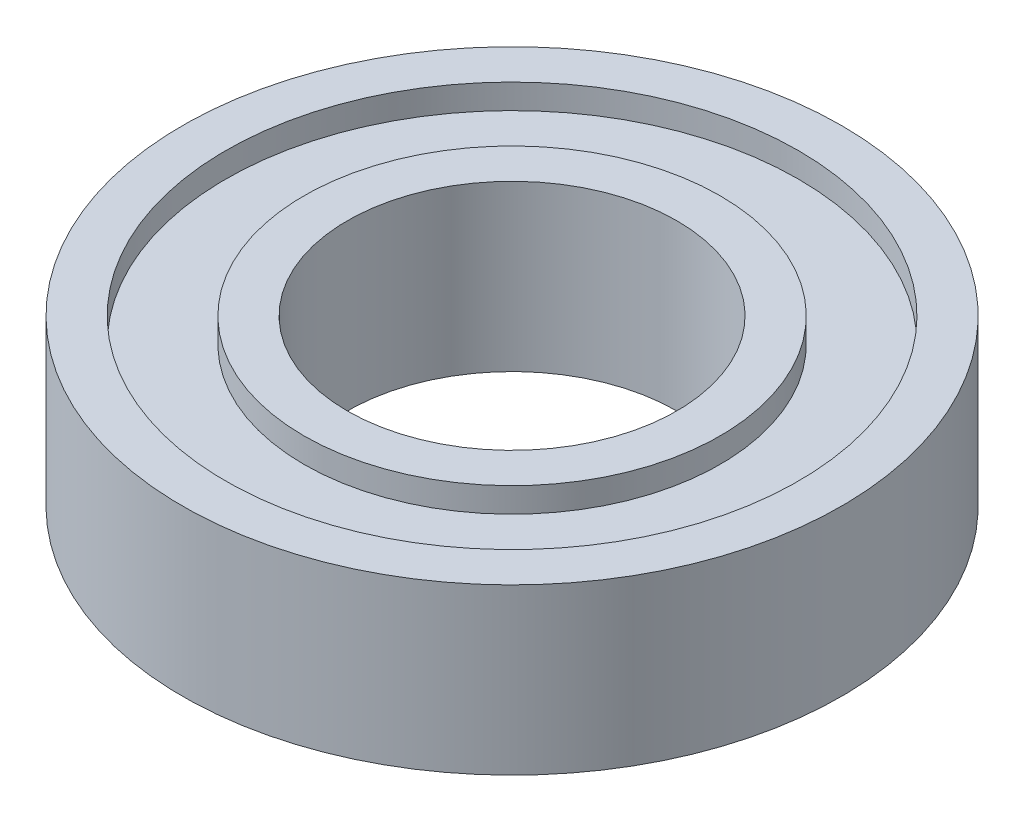
ISO-10303-21;
HEADER;
FILE_DESCRIPTION(('STEP AP214'),'2;1');
FILE_NAME('part.step','',(''),(''),'','','');
FILE_SCHEMA(('AUTOMOTIVE_DESIGN { 1 0 10303 214 1 1 1 1 }'));
ENDSEC;
DATA;
#1=APPLICATION_CONTEXT('core data for automotive mechanical design processes');
#2=APPLICATION_PROTOCOL_DEFINITION('international standard','automotive_design',2000,#1);
#3=PRODUCT_CONTEXT('',#1,'mechanical');
#4=PRODUCT('Part','Part','',(#3));
#5=PRODUCT_RELATED_PRODUCT_CATEGORY('part','',(#4));
#6=PRODUCT_DEFINITION_FORMATION('','',#4);
#7=PRODUCT_DEFINITION_CONTEXT('part definition',#1,'design');
#8=PRODUCT_DEFINITION('design','',#6,#7);
#9=PRODUCT_DEFINITION_SHAPE('','',#8);
#10=(LENGTH_UNIT() NAMED_UNIT(*) SI_UNIT(.MILLI.,.METRE.));
#11=(NAMED_UNIT(*) PLANE_ANGLE_UNIT() SI_UNIT($,.RADIAN.));
#12=(NAMED_UNIT(*) SI_UNIT($,.STERADIAN.) SOLID_ANGLE_UNIT());
#13=UNCERTAINTY_MEASURE_WITH_UNIT(LENGTH_MEASURE(1.E-05),#10,'distance_accuracy_value','');
#14=(GEOMETRIC_REPRESENTATION_CONTEXT(3) GLOBAL_UNCERTAINTY_ASSIGNED_CONTEXT((#13)) GLOBAL_UNIT_ASSIGNED_CONTEXT((#10,
#11,#12)) REPRESENTATION_CONTEXT('',''));
#15=CARTESIAN_POINT('',(0.,0.,0.));
#16=DIRECTION('',(0.,0.,1.));
#17=DIRECTION('',(1.,0.,0.));
#18=AXIS2_PLACEMENT_3D('',#15,#16,#17);
#19=CARTESIAN_POINT('',(5.05,0.,0.));
#20=DIRECTION('',(0.,-1.,0.));
#21=DIRECTION('',(0.,0.,-1.));
#22=AXIS2_PLACEMENT_3D('',#19,#20,#21);
#23=PLANE('',#22);
#24=CARTESIAN_POINT('',(0.,0.,0.));
#25=DIRECTION('',(0.,-1.,0.));
#26=DIRECTION('',(0.,0.,-1.));
#27=AXIS2_PLACEMENT_3D('',#24,#25,#26);
#28=CIRCLE('',#27,5.05);
#29=CARTESIAN_POINT('',(0.,0.,-5.05));
#30=VERTEX_POINT('',#29);
#31=EDGE_CURVE('E96',#30,#30,#28,.T.);
#32=ORIENTED_EDGE('',*,*,#31,.T.);
#33=EDGE_LOOP('',(#32));
#34=FACE_BOUND('',#33,.T.);
#35=CARTESIAN_POINT('',(0.,0.,0.));
#36=DIRECTION('',(0.,-1.,0.));
#37=DIRECTION('',(0.,0.,-1.));
#38=AXIS2_PLACEMENT_3D('',#35,#36,#37);
#39=CIRCLE('',#38,4.);
#40=CARTESIAN_POINT('',(0.,0.,-4.));
#41=VERTEX_POINT('',#40);
#42=EDGE_CURVE('E10',#41,#41,#39,.T.);
#43=ORIENTED_EDGE('',*,*,#42,.F.);
#44=EDGE_LOOP('',(#43));
#45=FACE_BOUND('',#44,.T.);
#46=ADVANCED_FACE('F45',(#34,#45),#23,.T.);
#47=CARTESIAN_POINT('',(0.,0.,0.));
#48=DIRECTION('',(0.,-1.,0.));
#49=DIRECTION('',(0.,0.,-1.));
#50=AXIS2_PLACEMENT_3D('',#47,#48,#49);
#51=CYLINDRICAL_SURFACE('',#50,4.);
#52=ORIENTED_EDGE('',*,*,#42,.T.);
#53=EDGE_LOOP('',(#52));
#54=FACE_BOUND('',#53,.T.);
#55=CARTESIAN_POINT('',(0.,4.,0.));
#56=DIRECTION('',(0.,-1.,0.));
#57=DIRECTION('',(0.,0.,-1.));
#58=AXIS2_PLACEMENT_3D('',#55,#56,#57);
#59=CIRCLE('',#58,4.);
#60=CARTESIAN_POINT('',(0.,4.,-4.));
#61=VERTEX_POINT('',#60);
#62=EDGE_CURVE('E52',#61,#61,#59,.T.);
#63=ORIENTED_EDGE('',*,*,#62,.F.);
#64=EDGE_LOOP('',(#63));
#65=FACE_BOUND('',#64,.T.);
#66=ADVANCED_FACE('F115',(#54,#65),#51,.F.);
#67=CARTESIAN_POINT('',(4.,4.,0.));
#68=DIRECTION('',(0.,1.,0.));
#69=DIRECTION('',(0.,0.,1.));
#70=AXIS2_PLACEMENT_3D('',#67,#68,#69);
#71=PLANE('',#70);
#72=ORIENTED_EDGE('',*,*,#62,.T.);
#73=EDGE_LOOP('',(#72));
#74=FACE_BOUND('',#73,.T.);
#75=CARTESIAN_POINT('',(0.,4.,0.));
#76=DIRECTION('',(0.,-1.,0.));
#77=DIRECTION('',(0.,0.,-1.));
#78=AXIS2_PLACEMENT_3D('',#75,#76,#77);
#79=CIRCLE('',#78,5.05);
#80=CARTESIAN_POINT('',(0.,4.,-5.05));
#81=VERTEX_POINT('',#80);
#82=EDGE_CURVE('E59',#81,#81,#79,.T.);
#83=ORIENTED_EDGE('',*,*,#82,.F.);
#84=EDGE_LOOP('',(#83));
#85=FACE_BOUND('',#84,.T.);
#86=ADVANCED_FACE('F119',(#74,#85),#71,.T.);
#87=CARTESIAN_POINT('',(0.,0.,0.));
#88=DIRECTION('',(0.,-1.,0.));
#89=DIRECTION('',(0.,0.,-1.));
#90=AXIS2_PLACEMENT_3D('',#87,#88,#89);
#91=CYLINDRICAL_SURFACE('',#90,5.05);
#92=ORIENTED_EDGE('',*,*,#82,.T.);
#93=EDGE_LOOP('',(#92));
#94=FACE_BOUND('',#93,.T.);
#95=CARTESIAN_POINT('',(0.,3.4,0.));
#96=DIRECTION('',(0.,-1.,0.));
#97=DIRECTION('',(0.,0.,-1.));
#98=AXIS2_PLACEMENT_3D('',#95,#96,#97);
#99=CIRCLE('',#98,5.05);
#100=CARTESIAN_POINT('',(0.,3.4,-5.05));
#101=VERTEX_POINT('',#100);
#102=EDGE_CURVE('E65',#101,#101,#99,.T.);
#103=ORIENTED_EDGE('',*,*,#102,.F.);
#104=EDGE_LOOP('',(#103));
#105=FACE_BOUND('',#104,.T.);
#106=ADVANCED_FACE('F121',(#94,#105),#91,.T.);
#107=CARTESIAN_POINT('',(5.05,3.4,0.));
#108=DIRECTION('',(0.,1.,0.));
#109=DIRECTION('',(0.,0.,1.));
#110=AXIS2_PLACEMENT_3D('',#107,#108,#109);
#111=PLANE('',#110);
#112=ORIENTED_EDGE('',*,*,#102,.T.);
#113=EDGE_LOOP('',(#112));
#114=FACE_BOUND('',#113,.T.);
#115=CARTESIAN_POINT('',(0.,3.4,0.));
#116=DIRECTION('',(0.,-1.,0.));
#117=DIRECTION('',(0.,0.,-1.));
#118=AXIS2_PLACEMENT_3D('',#115,#116,#117);
#119=CIRCLE('',#118,6.95);
#120=CARTESIAN_POINT('',(0.,3.4,-6.95));
#121=VERTEX_POINT('',#120);
#122=EDGE_CURVE('E70',#121,#121,#119,.T.);
#123=ORIENTED_EDGE('',*,*,#122,.F.);
#124=EDGE_LOOP('',(#123));
#125=FACE_BOUND('',#124,.T.);
#126=ADVANCED_FACE('F127',(#114,#125),#111,.T.);
#127=CARTESIAN_POINT('',(0.,0.,0.));
#128=DIRECTION('',(0.,-1.,0.));
#129=DIRECTION('',(0.,0.,-1.));
#130=AXIS2_PLACEMENT_3D('',#127,#128,#129);
#131=CYLINDRICAL_SURFACE('',#130,6.95);
#132=ORIENTED_EDGE('',*,*,#122,.T.);
#133=EDGE_LOOP('',(#132));
#134=FACE_BOUND('',#133,.T.);
#135=CARTESIAN_POINT('',(0.,4.,0.));
#136=DIRECTION('',(0.,-1.,0.));
#137=DIRECTION('',(0.,0.,-1.));
#138=AXIS2_PLACEMENT_3D('',#135,#136,#137);
#139=CIRCLE('',#138,6.95);
#140=CARTESIAN_POINT('',(0.,4.,-6.95));
#141=VERTEX_POINT('',#140);
#142=EDGE_CURVE('E74',#141,#141,#139,.T.);
#143=ORIENTED_EDGE('',*,*,#142,.F.);
#144=EDGE_LOOP('',(#143));
#145=FACE_BOUND('',#144,.T.);
#146=ADVANCED_FACE('F131',(#134,#145),#131,.F.);
#147=CARTESIAN_POINT('',(6.95,4.,0.));
#148=DIRECTION('',(0.,1.,0.));
#149=DIRECTION('',(0.,0.,1.));
#150=AXIS2_PLACEMENT_3D('',#147,#148,#149);
#151=PLANE('',#150);
#152=ORIENTED_EDGE('',*,*,#142,.T.);
#153=EDGE_LOOP('',(#152));
#154=FACE_BOUND('',#153,.T.);
#155=CARTESIAN_POINT('',(0.,4.,0.));
#156=DIRECTION('',(0.,-1.,0.));
#157=DIRECTION('',(0.,0.,-1.));
#158=AXIS2_PLACEMENT_3D('',#155,#156,#157);
#159=CIRCLE('',#158,8.);
#160=CARTESIAN_POINT('',(0.,4.,-8.));
#161=VERTEX_POINT('',#160);
#162=EDGE_CURVE('E78',#161,#161,#159,.T.);
#163=ORIENTED_EDGE('',*,*,#162,.F.);
#164=EDGE_LOOP('',(#163));
#165=FACE_BOUND('',#164,.T.);
#166=ADVANCED_FACE('F135',(#154,#165),#151,.T.);
#167=CARTESIAN_POINT('',(0.,0.,0.));
#168=DIRECTION('',(0.,-1.,0.));
#169=DIRECTION('',(0.,0.,-1.));
#170=AXIS2_PLACEMENT_3D('',#167,#168,#169);
#171=CYLINDRICAL_SURFACE('',#170,8.);
#172=ORIENTED_EDGE('',*,*,#162,.T.);
#173=EDGE_LOOP('',(#172));
#174=FACE_BOUND('',#173,.T.);
#175=CARTESIAN_POINT('',(0.,0.,0.));
#176=DIRECTION('',(0.,-1.,0.));
#177=DIRECTION('',(0.,0.,-1.));
#178=AXIS2_PLACEMENT_3D('',#175,#176,#177);
#179=CIRCLE('',#178,8.);
#180=CARTESIAN_POINT('',(0.,0.,-8.));
#181=VERTEX_POINT('',#180);
#182=EDGE_CURVE('E81',#181,#181,#179,.T.);
#183=ORIENTED_EDGE('',*,*,#182,.F.);
#184=EDGE_LOOP('',(#183));
#185=FACE_BOUND('',#184,.T.);
#186=ADVANCED_FACE('F138',(#174,#185),#171,.T.);
#187=CARTESIAN_POINT('',(8.,0.,0.));
#188=DIRECTION('',(0.,-1.,0.));
#189=DIRECTION('',(0.,0.,-1.));
#190=AXIS2_PLACEMENT_3D('',#187,#188,#189);
#191=PLANE('',#190);
#192=ORIENTED_EDGE('',*,*,#182,.T.);
#193=EDGE_LOOP('',(#192));
#194=FACE_BOUND('',#193,.T.);
#195=CARTESIAN_POINT('',(0.,0.,0.));
#196=DIRECTION('',(0.,-1.,0.));
#197=DIRECTION('',(0.,0.,-1.));
#198=AXIS2_PLACEMENT_3D('',#195,#196,#197);
#199=CIRCLE('',#198,6.95);
#200=CARTESIAN_POINT('',(0.,0.,-6.95));
#201=VERTEX_POINT('',#200);
#202=EDGE_CURVE('E85',#201,#201,#199,.T.);
#203=ORIENTED_EDGE('',*,*,#202,.F.);
#204=EDGE_LOOP('',(#203));
#205=FACE_BOUND('',#204,.T.);
#206=ADVANCED_FACE('F142',(#194,#205),#191,.T.);
#207=CARTESIAN_POINT('',(0.,0.,0.));
#208=DIRECTION('',(0.,-1.,0.));
#209=DIRECTION('',(0.,0.,-1.));
#210=AXIS2_PLACEMENT_3D('',#207,#208,#209);
#211=CYLINDRICAL_SURFACE('',#210,6.95);
#212=ORIENTED_EDGE('',*,*,#202,.T.);
#213=EDGE_LOOP('',(#212));
#214=FACE_BOUND('',#213,.T.);
#215=CARTESIAN_POINT('',(0.,0.6,0.));
#216=DIRECTION('',(0.,-1.,0.));
#217=DIRECTION('',(0.,0.,-1.));
#218=AXIS2_PLACEMENT_3D('',#215,#216,#217);
#219=CIRCLE('',#218,6.95);
#220=CARTESIAN_POINT('',(0.,0.6,-6.95));
#221=VERTEX_POINT('',#220);
#222=EDGE_CURVE('E89',#221,#221,#219,.T.);
#223=ORIENTED_EDGE('',*,*,#222,.F.);
#224=EDGE_LOOP('',(#223));
#225=FACE_BOUND('',#224,.T.);
#226=ADVANCED_FACE('F111',(#214,#225),#211,.F.);
#227=CARTESIAN_POINT('',(6.95,0.6,0.));
#228=DIRECTION('',(0.,-1.,0.));
#229=DIRECTION('',(0.,0.,-1.));
#230=AXIS2_PLACEMENT_3D('',#227,#228,#229);
#231=PLANE('',#230);
#232=ORIENTED_EDGE('',*,*,#222,.T.);
#233=EDGE_LOOP('',(#232));
#234=FACE_BOUND('',#233,.T.);
#235=CARTESIAN_POINT('',(0.,0.6,0.));
#236=DIRECTION('',(0.,-1.,0.));
#237=DIRECTION('',(0.,0.,-1.));
#238=AXIS2_PLACEMENT_3D('',#235,#236,#237);
#239=CIRCLE('',#238,5.05);
#240=CARTESIAN_POINT('',(0.,0.6,-5.05));
#241=VERTEX_POINT('',#240);
#242=EDGE_CURVE('E93',#241,#241,#239,.T.);
#243=ORIENTED_EDGE('',*,*,#242,.F.);
#244=EDGE_LOOP('',(#243));
#245=FACE_BOUND('',#244,.T.);
#246=ADVANCED_FACE('F105',(#234,#245),#231,.T.);
#247=CARTESIAN_POINT('',(0.,0.,0.));
#248=DIRECTION('',(0.,-1.,0.));
#249=DIRECTION('',(0.,0.,-1.));
#250=AXIS2_PLACEMENT_3D('',#247,#248,#249);
#251=CYLINDRICAL_SURFACE('',#250,5.05);
#252=ORIENTED_EDGE('',*,*,#242,.T.);
#253=EDGE_LOOP('',(#252));
#254=FACE_BOUND('',#253,.T.);
#255=ORIENTED_EDGE('',*,*,#31,.F.);
#256=EDGE_LOOP('',(#255));
#257=FACE_BOUND('',#256,.T.);
#258=ADVANCED_FACE('F103',(#254,#257),#251,.T.);
#259=CLOSED_SHELL('',(#46,#66,#86,#106,#126,#146,#166,#186,#206,#226,#246,#258));
#260=MANIFOLD_SOLID_BREP('B2',#259);
#261=ADVANCED_BREP_SHAPE_REPRESENTATION('',(#18,#260),#14);
#262=SHAPE_DEFINITION_REPRESENTATION(#9,#261);
ENDSEC;
END-ISO-10303-21;
